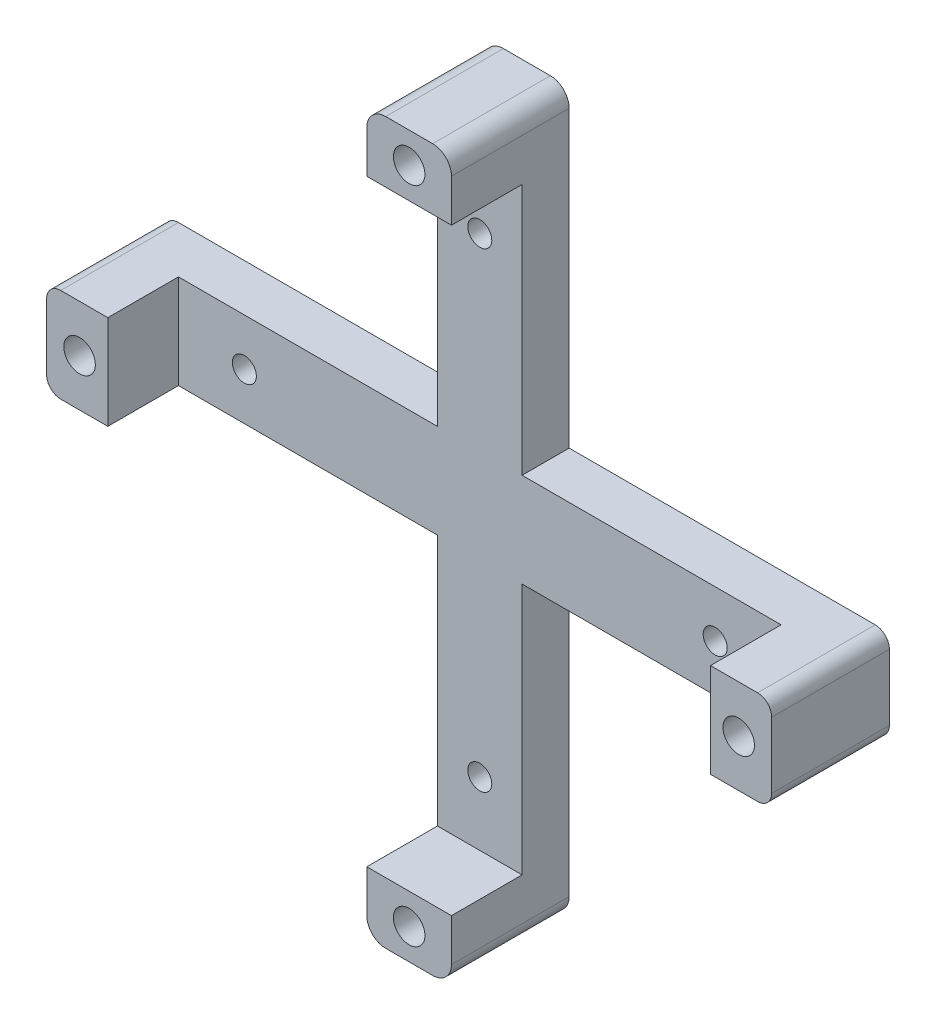
ISO-10303-21;
HEADER;
FILE_DESCRIPTION(('STEP AP214'),'2;1');
FILE_NAME('part.step','',(''),(''),'','','');
FILE_SCHEMA(('AUTOMOTIVE_DESIGN { 1 0 10303 214 1 1 1 1 }'));
ENDSEC;
DATA;
#1=APPLICATION_CONTEXT('core data for automotive mechanical design processes');
#2=APPLICATION_PROTOCOL_DEFINITION('international standard','automotive_design',2000,#1);
#3=PRODUCT_CONTEXT('',#1,'mechanical');
#4=PRODUCT('Part','Part','',(#3));
#5=PRODUCT_RELATED_PRODUCT_CATEGORY('part','',(#4));
#6=PRODUCT_DEFINITION_FORMATION('','',#4);
#7=PRODUCT_DEFINITION_CONTEXT('part definition',#1,'design');
#8=PRODUCT_DEFINITION('design','',#6,#7);
#9=PRODUCT_DEFINITION_SHAPE('','',#8);
#10=(LENGTH_UNIT() NAMED_UNIT(*) SI_UNIT(.MILLI.,.METRE.));
#11=(NAMED_UNIT(*) PLANE_ANGLE_UNIT() SI_UNIT($,.RADIAN.));
#12=(NAMED_UNIT(*) SI_UNIT($,.STERADIAN.) SOLID_ANGLE_UNIT());
#13=UNCERTAINTY_MEASURE_WITH_UNIT(LENGTH_MEASURE(1.E-05),#10,'distance_accuracy_value','');
#14=(GEOMETRIC_REPRESENTATION_CONTEXT(3) GLOBAL_UNCERTAINTY_ASSIGNED_CONTEXT((#13)) GLOBAL_UNIT_ASSIGNED_CONTEXT((#10,
#11,#12)) REPRESENTATION_CONTEXT('',''));
#15=CARTESIAN_POINT('',(0.,0.,0.));
#16=DIRECTION('',(0.,0.,1.));
#17=DIRECTION('',(1.,0.,0.));
#18=AXIS2_PLACEMENT_3D('',#15,#16,#17);
#19=CARTESIAN_POINT('',(93.98,8.89000000000001,12.7));
#20=DIRECTION('',(0.,0.,1.));
#21=DIRECTION('',(1.,0.,0.));
#22=AXIS2_PLACEMENT_3D('',#19,#20,#21);
#23=PLANE('',#22);
#24=CARTESIAN_POINT('',(0.,63.5,12.7));
#25=DIRECTION('',(0.,0.,1.));
#26=DIRECTION('',(1.,0.,0.));
#27=AXIS2_PLACEMENT_3D('',#24,#25,#26);
#28=CIRCLE('',#27,3.2385);
#29=CARTESIAN_POINT('',(3.2385,63.5,12.7));
#30=VERTEX_POINT('',#29);
#31=EDGE_CURVE('E543',#30,#30,#28,.T.);
#32=ORIENTED_EDGE('',*,*,#31,.F.);
#33=EDGE_LOOP('',(#32));
#34=FACE_BOUND('',#33,.T.);
#35=CARTESIAN_POINT('',(63.5,0.,12.7));
#36=DIRECTION('',(0.,0.,1.));
#37=DIRECTION('',(1.,0.,0.));
#38=AXIS2_PLACEMENT_3D('',#35,#36,#37);
#39=CIRCLE('',#38,3.23850000000001);
#40=CARTESIAN_POINT('',(66.7385,0.,12.7));
#41=VERTEX_POINT('',#40);
#42=EDGE_CURVE('E548',#41,#41,#39,.T.);
#43=ORIENTED_EDGE('',*,*,#42,.F.);
#44=EDGE_LOOP('',(#43));
#45=FACE_BOUND('',#44,.T.);
#46=CARTESIAN_POINT('',(0.,-63.5,12.7));
#47=DIRECTION('',(0.,0.,1.));
#48=DIRECTION('',(1.,0.,0.));
#49=AXIS2_PLACEMENT_3D('',#46,#47,#48);
#50=CIRCLE('',#49,3.2385);
#51=CARTESIAN_POINT('',(3.2385,-63.5,12.7));
#52=VERTEX_POINT('',#51);
#53=EDGE_CURVE('E556',#52,#52,#50,.T.);
#54=ORIENTED_EDGE('',*,*,#53,.F.);
#55=EDGE_LOOP('',(#54));
#56=FACE_BOUND('',#55,.T.);
#57=CARTESIAN_POINT('',(-63.5,0.,12.7));
#58=DIRECTION('',(0.,0.,1.));
#59=DIRECTION('',(1.,0.,0.));
#60=AXIS2_PLACEMENT_3D('',#57,#58,#59);
#61=CIRCLE('',#60,3.2385);
#62=CARTESIAN_POINT('',(-60.2615,0.,12.7));
#63=VERTEX_POINT('',#62);
#64=EDGE_CURVE('E562',#63,#63,#61,.T.);
#65=ORIENTED_EDGE('',*,*,#64,.F.);
#66=EDGE_LOOP('',(#65));
#67=FACE_BOUND('',#66,.T.);
#68=DIRECTION('',(0.,-1.,0.));
#69=VECTOR('',#68,1.);
#70=CARTESIAN_POINT('',(-11.4153842055131,-92.075,12.7));
#71=LINE('',#70,#69);
#72=CARTESIAN_POINT('',(-11.4153842055131,-12.7,12.7));
#73=VERTEX_POINT('',#72);
#74=CARTESIAN_POINT('',(-11.4153842055131,-80.645,12.7));
#75=VERTEX_POINT('',#74);
#76=EDGE_CURVE('E61',#73,#75,#71,.T.);
#77=ORIENTED_EDGE('',*,*,#76,.T.);
#78=DIRECTION('',(-1.,0.,0.));
#79=VECTOR('',#78,1.);
#80=CARTESIAN_POINT('',(0.,-80.645,12.7));
#81=LINE('',#80,#79);
#82=CARTESIAN_POINT('',(11.4153842055131,-80.645,12.7));
#83=VERTEX_POINT('',#82);
#84=EDGE_CURVE('E56',#83,#75,#81,.T.);
#85=ORIENTED_EDGE('',*,*,#84,.F.);
#86=DIRECTION('',(0.,1.,0.));
#87=VECTOR('',#86,1.);
#88=CARTESIAN_POINT('',(11.4153842055131,-92.075,12.7));
#89=LINE('',#88,#87);
#90=CARTESIAN_POINT('',(11.4153842055131,-12.7,12.7));
#91=VERTEX_POINT('',#90);
#92=EDGE_CURVE('E248',#83,#91,#89,.T.);
#93=ORIENTED_EDGE('',*,*,#92,.T.);
#94=DIRECTION('',(1.,0.,0.));
#95=VECTOR('',#94,1.);
#96=CARTESIAN_POINT('',(93.98,-12.7,12.7));
#97=LINE('',#96,#95);
#98=CARTESIAN_POINT('',(81.28,-12.7,12.7));
#99=VERTEX_POINT('',#98);
#100=EDGE_CURVE('E403',#91,#99,#97,.T.);
#101=ORIENTED_EDGE('',*,*,#100,.T.);
#102=DIRECTION('',(0.,-1.,0.));
#103=VECTOR('',#102,1.);
#104=CARTESIAN_POINT('',(81.28,0.,12.7));
#105=LINE('',#104,#103);
#106=CARTESIAN_POINT('',(81.28,12.7,12.7));
#107=VERTEX_POINT('',#106);
#108=EDGE_CURVE('E249',#107,#99,#105,.T.);
#109=ORIENTED_EDGE('',*,*,#108,.F.);
#110=DIRECTION('',(-1.,0.,0.));
#111=VECTOR('',#110,1.);
#112=CARTESIAN_POINT('',(93.98,12.7,12.7));
#113=LINE('',#112,#111);
#114=CARTESIAN_POINT('',(11.4153842055131,12.7,12.7));
#115=VERTEX_POINT('',#114);
#116=EDGE_CURVE('E401',#107,#115,#113,.T.);
#117=ORIENTED_EDGE('',*,*,#116,.T.);
#118=CARTESIAN_POINT('',(11.4153842055131,80.645,12.7));
#119=VERTEX_POINT('',#118);
#120=EDGE_CURVE('E344',#115,#119,#89,.T.);
#121=ORIENTED_EDGE('',*,*,#120,.T.);
#122=DIRECTION('',(1.,0.,0.));
#123=VECTOR('',#122,1.);
#124=CARTESIAN_POINT('',(0.,80.645,12.7));
#125=LINE('',#124,#123);
#126=CARTESIAN_POINT('',(-11.4153842055131,80.645,12.7));
#127=VERTEX_POINT('',#126);
#128=EDGE_CURVE('E282',#127,#119,#125,.T.);
#129=ORIENTED_EDGE('',*,*,#128,.F.);
#130=CARTESIAN_POINT('',(-11.4153842055131,12.7,12.7));
#131=VERTEX_POINT('',#130);
#132=EDGE_CURVE('E349',#127,#131,#71,.T.);
#133=ORIENTED_EDGE('',*,*,#132,.T.);
#134=CARTESIAN_POINT('',(-81.28,12.7,12.7));
#135=VERTEX_POINT('',#134);
#136=EDGE_CURVE('E404',#131,#135,#113,.T.);
#137=ORIENTED_EDGE('',*,*,#136,.T.);
#138=DIRECTION('',(0.,-1.,0.));
#139=VECTOR('',#138,1.);
#140=CARTESIAN_POINT('',(-81.28,0.,12.7));
#141=LINE('',#140,#139);
#142=CARTESIAN_POINT('',(-81.28,-12.7,12.7));
#143=VERTEX_POINT('',#142);
#144=EDGE_CURVE('E311',#135,#143,#141,.T.);
#145=ORIENTED_EDGE('',*,*,#144,.T.);
#146=EDGE_CURVE('E405',#143,#73,#97,.T.);
#147=ORIENTED_EDGE('',*,*,#146,.T.);
#148=EDGE_LOOP('',(#77,#85,#93,#101,#109,#117,#121,#129,#133,#137,#145,#147));
#149=FACE_BOUND('',#148,.T.);
#150=ADVANCED_FACE('F41',(#34,#45,#56,#67,#149),#23,.T.);
#151=CARTESIAN_POINT('',(93.98,12.7,12.7));
#152=DIRECTION('',(0.,-1.,0.));
#153=DIRECTION('',(1.,0.,0.));
#154=AXIS2_PLACEMENT_3D('',#151,#152,#153);
#155=PLANE('',#154);
#156=ORIENTED_EDGE('',*,*,#136,.F.);
#157=DIRECTION('',(0.,0.,-1.));
#158=VECTOR('',#157,1.);
#159=CARTESIAN_POINT('',(-11.4153842055131,12.7,12.7));
#160=LINE('',#159,#158);
#161=CARTESIAN_POINT('',(-11.4153842055131,12.7,0.));
#162=VERTEX_POINT('',#161);
#163=EDGE_CURVE('E391',#131,#162,#160,.T.);
#164=ORIENTED_EDGE('',*,*,#163,.T.);
#165=DIRECTION('',(-1.,0.,0.));
#166=VECTOR('',#165,1.);
#167=CARTESIAN_POINT('',(93.98,12.7,0.));
#168=LINE('',#167,#166);
#169=CARTESIAN_POINT('',(-93.98,12.7,0.));
#170=VERTEX_POINT('',#169);
#171=EDGE_CURVE('E410',#162,#170,#168,.T.);
#172=ORIENTED_EDGE('',*,*,#171,.T.);
#173=DIRECTION('',(0.,0.,-1.));
#174=VECTOR('',#173,1.);
#175=CARTESIAN_POINT('',(-93.98,12.7,12.7));
#176=LINE('',#175,#174);
#177=CARTESIAN_POINT('',(-93.98,12.7,31.75));
#178=VERTEX_POINT('',#177);
#179=EDGE_CURVE('E445',#178,#170,#176,.T.);
#180=ORIENTED_EDGE('',*,*,#179,.F.);
#181=DIRECTION('',(-1.,0.,0.));
#182=VECTOR('',#181,1.);
#183=CARTESIAN_POINT('',(0.,12.7,31.75));
#184=LINE('',#183,#182);
#185=CARTESIAN_POINT('',(-81.28,12.7,31.75));
#186=VERTEX_POINT('',#185);
#187=EDGE_CURVE('E315',#186,#178,#184,.T.);
#188=ORIENTED_EDGE('',*,*,#187,.F.);
#189=DIRECTION('',(0.,0.,-1.));
#190=VECTOR('',#189,1.);
#191=CARTESIAN_POINT('',(-81.28,12.7,31.75));
#192=LINE('',#191,#190);
#193=EDGE_CURVE('E336',#186,#135,#192,.T.);
#194=ORIENTED_EDGE('',*,*,#193,.T.);
#195=EDGE_LOOP('',(#156,#164,#172,#180,#188,#194));
#196=FACE_BOUND('',#195,.T.);
#197=ADVANCED_FACE('F511',(#196),#155,.F.);
#198=CARTESIAN_POINT('',(93.98,-12.7,12.7));
#199=DIRECTION('',(0.,1.,0.));
#200=DIRECTION('',(-1.,0.,0.));
#201=AXIS2_PLACEMENT_3D('',#198,#199,#200);
#202=PLANE('',#201);
#203=DIRECTION('',(1.,0.,0.));
#204=VECTOR('',#203,1.);
#205=CARTESIAN_POINT('',(93.98,-12.7,0.));
#206=LINE('',#205,#204);
#207=CARTESIAN_POINT('',(-93.98,-12.7,0.));
#208=VERTEX_POINT('',#207);
#209=CARTESIAN_POINT('',(-11.4153842055131,-12.7,0.));
#210=VERTEX_POINT('',#209);
#211=EDGE_CURVE('E421',#208,#210,#206,.T.);
#212=ORIENTED_EDGE('',*,*,#211,.T.);
#213=DIRECTION('',(0.,0.,1.));
#214=VECTOR('',#213,1.);
#215=CARTESIAN_POINT('',(-11.4153842055131,-12.7,12.7));
#216=LINE('',#215,#214);
#217=EDGE_CURVE('E11',#210,#73,#216,.T.);
#218=ORIENTED_EDGE('',*,*,#217,.T.);
#219=ORIENTED_EDGE('',*,*,#146,.F.);
#220=DIRECTION('',(0.,0.,-1.));
#221=VECTOR('',#220,1.);
#222=CARTESIAN_POINT('',(-81.28,-12.7,31.75));
#223=LINE('',#222,#221);
#224=CARTESIAN_POINT('',(-81.28,-12.7,31.75));
#225=VERTEX_POINT('',#224);
#226=EDGE_CURVE('E332',#225,#143,#223,.T.);
#227=ORIENTED_EDGE('',*,*,#226,.F.);
#228=DIRECTION('',(1.,0.,0.));
#229=VECTOR('',#228,1.);
#230=CARTESIAN_POINT('',(0.,-12.7,31.75));
#231=LINE('',#230,#229);
#232=CARTESIAN_POINT('',(-93.98,-12.7,31.75));
#233=VERTEX_POINT('',#232);
#234=EDGE_CURVE('E327',#233,#225,#231,.T.);
#235=ORIENTED_EDGE('',*,*,#234,.F.);
#236=DIRECTION('',(0.,0.,-1.));
#237=VECTOR('',#236,1.);
#238=CARTESIAN_POINT('',(-93.98,-12.7,12.7));
#239=LINE('',#238,#237);
#240=EDGE_CURVE('E436',#233,#208,#239,.T.);
#241=ORIENTED_EDGE('',*,*,#240,.T.);
#242=EDGE_LOOP('',(#212,#218,#219,#227,#235,#241));
#243=FACE_BOUND('',#242,.T.);
#244=ADVANCED_FACE('F518',(#243),#202,.F.);
#245=CARTESIAN_POINT('',(93.98,8.89000000000001,0.));
#246=DIRECTION('',(0.,0.,1.));
#247=DIRECTION('',(1.,0.,0.));
#248=AXIS2_PLACEMENT_3D('',#245,#246,#247);
#249=PLANE('',#248);
#250=CARTESIAN_POINT('',(0.,63.5,0.));
#251=DIRECTION('',(0.,0.,1.));
#252=DIRECTION('',(1.,0.,0.));
#253=AXIS2_PLACEMENT_3D('',#250,#251,#252);
#254=CIRCLE('',#253,3.2385);
#255=CARTESIAN_POINT('',(3.2385,63.5,0.));
#256=VERTEX_POINT('',#255);
#257=EDGE_CURVE('E539',#256,#256,#254,.T.);
#258=ORIENTED_EDGE('',*,*,#257,.T.);
#259=EDGE_LOOP('',(#258));
#260=FACE_BOUND('',#259,.T.);
#261=CARTESIAN_POINT('',(63.5,0.,0.));
#262=DIRECTION('',(0.,0.,1.));
#263=DIRECTION('',(1.,0.,0.));
#264=AXIS2_PLACEMENT_3D('',#261,#262,#263);
#265=CIRCLE('',#264,3.23850000000001);
#266=CARTESIAN_POINT('',(66.7385,0.,0.));
#267=VERTEX_POINT('',#266);
#268=EDGE_CURVE('E553',#267,#267,#265,.T.);
#269=ORIENTED_EDGE('',*,*,#268,.T.);
#270=EDGE_LOOP('',(#269));
#271=FACE_BOUND('',#270,.T.);
#272=CARTESIAN_POINT('',(0.,-63.5,0.));
#273=DIRECTION('',(0.,0.,1.));
#274=DIRECTION('',(1.,0.,0.));
#275=AXIS2_PLACEMENT_3D('',#272,#273,#274);
#276=CIRCLE('',#275,3.2385);
#277=CARTESIAN_POINT('',(3.2385,-63.5,0.));
#278=VERTEX_POINT('',#277);
#279=EDGE_CURVE('E559',#278,#278,#276,.T.);
#280=ORIENTED_EDGE('',*,*,#279,.T.);
#281=EDGE_LOOP('',(#280));
#282=FACE_BOUND('',#281,.T.);
#283=CARTESIAN_POINT('',(-63.5,0.,0.));
#284=DIRECTION('',(0.,0.,1.));
#285=DIRECTION('',(1.,0.,0.));
#286=AXIS2_PLACEMENT_3D('',#283,#284,#285);
#287=CIRCLE('',#286,3.2385);
#288=CARTESIAN_POINT('',(-60.2615,0.,0.));
#289=VERTEX_POINT('',#288);
#290=EDGE_CURVE('E565',#289,#289,#287,.T.);
#291=ORIENTED_EDGE('',*,*,#290,.T.);
#292=EDGE_LOOP('',(#291));
#293=FACE_BOUND('',#292,.T.);
#294=CARTESIAN_POINT('',(11.4153842055131,-12.7,0.));
#295=VERTEX_POINT('',#294);
#296=CARTESIAN_POINT('',(93.98,-12.7,0.));
#297=VERTEX_POINT('',#296);
#298=EDGE_CURVE('E420',#295,#297,#206,.T.);
#299=ORIENTED_EDGE('',*,*,#298,.F.);
#300=DIRECTION('',(0.,1.,0.));
#301=VECTOR('',#300,1.);
#302=CARTESIAN_POINT('',(11.4153842055131,-92.075,0.));
#303=LINE('',#302,#301);
#304=CARTESIAN_POINT('',(11.4153842055131,-92.075,0.));
#305=VERTEX_POINT('',#304);
#306=EDGE_CURVE('E356',#305,#295,#303,.T.);
#307=ORIENTED_EDGE('',*,*,#306,.F.);
#308=CARTESIAN_POINT('',(6.33538420551314,-92.075,0.));
#309=DIRECTION('',(0.,0.,1.));
#310=DIRECTION('',(1.,0.,0.));
#311=AXIS2_PLACEMENT_3D('',#308,#309,#310);
#312=CIRCLE('',#311,5.07999999999999);
#313=CARTESIAN_POINT('',(6.33538420551314,-97.155,0.));
#314=VERTEX_POINT('',#313);
#315=EDGE_CURVE('E352',#314,#305,#312,.T.);
#316=ORIENTED_EDGE('',*,*,#315,.F.);
#317=DIRECTION('',(1.,0.,0.));
#318=VECTOR('',#317,1.);
#319=CARTESIAN_POINT('',(-6.33538420551314,-97.155,0.));
#320=LINE('',#319,#318);
#321=CARTESIAN_POINT('',(-6.33538420551314,-97.155,0.));
#322=VERTEX_POINT('',#321);
#323=EDGE_CURVE('E348',#322,#314,#320,.T.);
#324=ORIENTED_EDGE('',*,*,#323,.F.);
#325=CARTESIAN_POINT('',(-6.33538420551314,-92.075,0.));
#326=DIRECTION('',(0.,0.,1.));
#327=DIRECTION('',(-1.,0.,0.));
#328=AXIS2_PLACEMENT_3D('',#325,#326,#327);
#329=CIRCLE('',#328,5.07999999999999);
#330=CARTESIAN_POINT('',(-11.4153842055131,-92.075,0.));
#331=VERTEX_POINT('',#330);
#332=EDGE_CURVE('E345',#331,#322,#329,.T.);
#333=ORIENTED_EDGE('',*,*,#332,.F.);
#334=DIRECTION('',(0.,-1.,0.));
#335=VECTOR('',#334,1.);
#336=CARTESIAN_POINT('',(-11.4153842055131,-92.075,0.));
#337=LINE('',#336,#335);
#338=EDGE_CURVE('E367',#210,#331,#337,.T.);
#339=ORIENTED_EDGE('',*,*,#338,.F.);
#340=ORIENTED_EDGE('',*,*,#211,.F.);
#341=CARTESIAN_POINT('',(-93.98,-8.89000000000001,0.));
#342=DIRECTION('',(0.,0.,1.));
#343=DIRECTION('',(-1.,0.,0.));
#344=AXIS2_PLACEMENT_3D('',#341,#342,#343);
#345=CIRCLE('',#344,3.81);
#346=CARTESIAN_POINT('',(-97.79,-8.89000000000001,0.));
#347=VERTEX_POINT('',#346);
#348=EDGE_CURVE('E418',#347,#208,#345,.T.);
#349=ORIENTED_EDGE('',*,*,#348,.F.);
#350=DIRECTION('',(0.,-1.,0.));
#351=VECTOR('',#350,1.);
#352=CARTESIAN_POINT('',(-97.79,-8.89000000000001,0.));
#353=LINE('',#352,#351);
#354=CARTESIAN_POINT('',(-97.79,8.88999999999999,0.));
#355=VERTEX_POINT('',#354);
#356=EDGE_CURVE('E416',#355,#347,#353,.T.);
#357=ORIENTED_EDGE('',*,*,#356,.F.);
#358=CARTESIAN_POINT('',(-93.98,8.88999999999999,0.));
#359=DIRECTION('',(0.,0.,1.));
#360=DIRECTION('',(1.,0.,0.));
#361=AXIS2_PLACEMENT_3D('',#358,#359,#360);
#362=CIRCLE('',#361,3.81);
#363=EDGE_CURVE('E414',#170,#355,#362,.T.);
#364=ORIENTED_EDGE('',*,*,#363,.F.);
#365=ORIENTED_EDGE('',*,*,#171,.F.);
#366=CARTESIAN_POINT('',(-11.4153842055131,92.075,0.));
#367=VERTEX_POINT('',#366);
#368=EDGE_CURVE('E368',#367,#162,#337,.T.);
#369=ORIENTED_EDGE('',*,*,#368,.F.);
#370=CARTESIAN_POINT('',(-6.33538420551314,92.075,0.));
#371=DIRECTION('',(0.,0.,1.));
#372=DIRECTION('',(-1.,0.,0.));
#373=AXIS2_PLACEMENT_3D('',#370,#371,#372);
#374=CIRCLE('',#373,5.08000000000001);
#375=CARTESIAN_POINT('',(-6.33538420551314,97.155,0.));
#376=VERTEX_POINT('',#375);
#377=EDGE_CURVE('E364',#376,#367,#374,.T.);
#378=ORIENTED_EDGE('',*,*,#377,.F.);
#379=DIRECTION('',(-1.,0.,0.));
#380=VECTOR('',#379,1.);
#381=CARTESIAN_POINT('',(-6.33538420551314,97.155,0.));
#382=LINE('',#381,#380);
#383=CARTESIAN_POINT('',(6.33538420551314,97.155,0.));
#384=VERTEX_POINT('',#383);
#385=EDGE_CURVE('E361',#384,#376,#382,.T.);
#386=ORIENTED_EDGE('',*,*,#385,.F.);
#387=CARTESIAN_POINT('',(6.33538420551314,92.075,0.));
#388=DIRECTION('',(0.,0.,1.));
#389=DIRECTION('',(-1.,0.,0.));
#390=AXIS2_PLACEMENT_3D('',#387,#388,#389);
#391=CIRCLE('',#390,5.08000000000001);
#392=CARTESIAN_POINT('',(11.4153842055131,92.075,0.));
#393=VERTEX_POINT('',#392);
#394=EDGE_CURVE('E358',#393,#384,#391,.T.);
#395=ORIENTED_EDGE('',*,*,#394,.F.);
#396=CARTESIAN_POINT('',(11.4153842055131,12.7,0.));
#397=VERTEX_POINT('',#396);
#398=EDGE_CURVE('E355',#397,#393,#303,.T.);
#399=ORIENTED_EDGE('',*,*,#398,.F.);
#400=CARTESIAN_POINT('',(93.98,12.7,0.));
#401=VERTEX_POINT('',#400);
#402=EDGE_CURVE('E411',#401,#397,#168,.T.);
#403=ORIENTED_EDGE('',*,*,#402,.F.);
#404=CARTESIAN_POINT('',(93.98,8.89000000000001,0.));
#405=DIRECTION('',(0.,0.,1.));
#406=DIRECTION('',(1.,0.,0.));
#407=AXIS2_PLACEMENT_3D('',#404,#405,#406);
#408=CIRCLE('',#407,3.81);
#409=CARTESIAN_POINT('',(97.79,8.89000000000001,0.));
#410=VERTEX_POINT('',#409);
#411=EDGE_CURVE('E400',#410,#401,#408,.T.);
#412=ORIENTED_EDGE('',*,*,#411,.F.);
#413=DIRECTION('',(0.,1.,0.));
#414=VECTOR('',#413,1.);
#415=CARTESIAN_POINT('',(97.79,-8.88999999999999,0.));
#416=LINE('',#415,#414);
#417=CARTESIAN_POINT('',(97.79,-8.88999999999999,0.));
#418=VERTEX_POINT('',#417);
#419=EDGE_CURVE('E426',#418,#410,#416,.T.);
#420=ORIENTED_EDGE('',*,*,#419,.F.);
#421=CARTESIAN_POINT('',(93.98,-8.88999999999999,0.));
#422=DIRECTION('',(0.,0.,1.));
#423=DIRECTION('',(1.,0.,0.));
#424=AXIS2_PLACEMENT_3D('',#421,#422,#423);
#425=CIRCLE('',#424,3.81);
#426=EDGE_CURVE('E424',#297,#418,#425,.T.);
#427=ORIENTED_EDGE('',*,*,#426,.F.);
#428=EDGE_LOOP('',(#299,#307,#316,#324,#333,#339,#340,#349,#357,#364,#365,#369,#378,#386,#395,
#399,#403,#412,#420,#427));
#429=FACE_BOUND('',#428,.T.);
#430=CARTESIAN_POINT('',(88.9,0.,0.));
#431=DIRECTION('',(0.,0.,1.));
#432=DIRECTION('',(1.,0.,0.));
#433=AXIS2_PLACEMENT_3D('',#430,#431,#432);
#434=CIRCLE('',#433,4.25000000000001);
#435=CARTESIAN_POINT('',(93.15,0.,0.));
#436=VERTEX_POINT('',#435);
#437=EDGE_CURVE('E394',#436,#436,#434,.T.);
#438=ORIENTED_EDGE('',*,*,#437,.T.);
#439=EDGE_LOOP('',(#438));
#440=FACE_BOUND('',#439,.T.);
#441=CARTESIAN_POINT('',(0.,-88.9,0.));
#442=DIRECTION('',(0.,0.,1.));
#443=DIRECTION('',(1.,0.,0.));
#444=AXIS2_PLACEMENT_3D('',#441,#442,#443);
#445=CIRCLE('',#444,4.25);
#446=CARTESIAN_POINT('',(4.25,-88.9,0.));
#447=VERTEX_POINT('',#446);
#448=EDGE_CURVE('E338',#447,#447,#445,.T.);
#449=ORIENTED_EDGE('',*,*,#448,.T.);
#450=EDGE_LOOP('',(#449));
#451=FACE_BOUND('',#450,.T.);
#452=CARTESIAN_POINT('',(0.,88.9,0.));
#453=DIRECTION('',(0.,0.,1.));
#454=DIRECTION('',(1.,0.,0.));
#455=AXIS2_PLACEMENT_3D('',#452,#453,#454);
#456=CIRCLE('',#455,4.25);
#457=CARTESIAN_POINT('',(4.25,88.9,0.));
#458=VERTEX_POINT('',#457);
#459=EDGE_CURVE('E341',#458,#458,#456,.T.);
#460=ORIENTED_EDGE('',*,*,#459,.T.);
#461=EDGE_LOOP('',(#460));
#462=FACE_BOUND('',#461,.T.);
#463=CARTESIAN_POINT('',(-88.9,0.,0.));
#464=DIRECTION('',(0.,0.,1.));
#465=DIRECTION('',(1.,0.,0.));
#466=AXIS2_PLACEMENT_3D('',#463,#464,#465);
#467=CIRCLE('',#466,4.25000000000001);
#468=CARTESIAN_POINT('',(-84.65,0.,0.));
#469=VERTEX_POINT('',#468);
#470=EDGE_CURVE('E397',#469,#469,#467,.T.);
#471=ORIENTED_EDGE('',*,*,#470,.T.);
#472=EDGE_LOOP('',(#471));
#473=FACE_BOUND('',#472,.T.);
#474=ADVANCED_FACE('F458',(#260,#271,#282,#293,#429,#440,#451,#462,#473),#249,.F.);
#475=CARTESIAN_POINT('',(93.98,8.89000000000001,12.7));
#476=DIRECTION('',(0.,0.,-1.));
#477=DIRECTION('',(-1.,0.,0.));
#478=AXIS2_PLACEMENT_3D('',#475,#476,#477);
#479=CYLINDRICAL_SURFACE('',#478,3.81);
#480=ORIENTED_EDGE('',*,*,#411,.T.);
#481=DIRECTION('',(0.,0.,-1.));
#482=VECTOR('',#481,1.);
#483=CARTESIAN_POINT('',(93.98,12.7,12.7));
#484=LINE('',#483,#482);
#485=CARTESIAN_POINT('',(93.98,12.7,31.75));
#486=VERTEX_POINT('',#485);
#487=EDGE_CURVE('E448',#486,#401,#484,.T.);
#488=ORIENTED_EDGE('',*,*,#487,.F.);
#489=CARTESIAN_POINT('',(93.98,8.89000000000001,31.75));
#490=DIRECTION('',(0.,0.,1.));
#491=DIRECTION('',(1.,0.,0.));
#492=AXIS2_PLACEMENT_3D('',#489,#490,#491);
#493=CIRCLE('',#492,3.81);
#494=CARTESIAN_POINT('',(97.79,8.89000000000001,31.75));
#495=VERTEX_POINT('',#494);
#496=EDGE_CURVE('E273',#495,#486,#493,.T.);
#497=ORIENTED_EDGE('',*,*,#496,.F.);
#498=DIRECTION('',(0.,0.,-1.));
#499=VECTOR('',#498,1.);
#500=CARTESIAN_POINT('',(97.79,8.89000000000001,12.7));
#501=LINE('',#500,#499);
#502=EDGE_CURVE('E407',#495,#410,#501,.T.);
#503=ORIENTED_EDGE('',*,*,#502,.T.);
#504=EDGE_LOOP('',(#480,#488,#497,#503));
#505=FACE_BOUND('',#504,.T.);
#506=ADVANCED_FACE('F43',(#505),#479,.T.);
#507=ORIENTED_EDGE('',*,*,#402,.T.);
#508=DIRECTION('',(0.,0.,1.));
#509=VECTOR('',#508,1.);
#510=CARTESIAN_POINT('',(11.4153842055131,12.7,12.7));
#511=LINE('',#510,#509);
#512=EDGE_CURVE('E375',#397,#115,#511,.T.);
#513=ORIENTED_EDGE('',*,*,#512,.T.);
#514=ORIENTED_EDGE('',*,*,#116,.F.);
#515=DIRECTION('',(0.,0.,-1.));
#516=VECTOR('',#515,1.);
#517=CARTESIAN_POINT('',(81.28,12.7,31.75));
#518=LINE('',#517,#516);
#519=CARTESIAN_POINT('',(81.28,12.7,31.75));
#520=VERTEX_POINT('',#519);
#521=EDGE_CURVE('E279',#520,#107,#518,.T.);
#522=ORIENTED_EDGE('',*,*,#521,.F.);
#523=DIRECTION('',(-1.,0.,0.));
#524=VECTOR('',#523,1.);
#525=CARTESIAN_POINT('',(0.,12.7,31.75));
#526=LINE('',#525,#524);
#527=EDGE_CURVE('E259',#486,#520,#526,.T.);
#528=ORIENTED_EDGE('',*,*,#527,.F.);
#529=ORIENTED_EDGE('',*,*,#487,.T.);
#530=EDGE_LOOP('',(#507,#513,#514,#522,#528,#529));
#531=FACE_BOUND('',#530,.T.);
#532=ADVANCED_FACE('F475',(#531),#155,.F.);
#533=CARTESIAN_POINT('',(-93.98,8.88999999999999,12.7));
#534=DIRECTION('',(0.,0.,-1.));
#535=DIRECTION('',(-1.,0.,0.));
#536=AXIS2_PLACEMENT_3D('',#533,#534,#535);
#537=CYLINDRICAL_SURFACE('',#536,3.81);
#538=ORIENTED_EDGE('',*,*,#363,.T.);
#539=DIRECTION('',(0.,0.,-1.));
#540=VECTOR('',#539,1.);
#541=CARTESIAN_POINT('',(-97.79,8.88999999999999,12.7));
#542=LINE('',#541,#540);
#543=CARTESIAN_POINT('',(-97.79,8.88999999999998,31.75));
#544=VERTEX_POINT('',#543);
#545=EDGE_CURVE('E442',#544,#355,#542,.T.);
#546=ORIENTED_EDGE('',*,*,#545,.F.);
#547=CARTESIAN_POINT('',(-93.98,8.88999999999999,31.75));
#548=DIRECTION('',(0.,0.,1.));
#549=DIRECTION('',(1.,0.,0.));
#550=AXIS2_PLACEMENT_3D('',#547,#548,#549);
#551=CIRCLE('',#550,3.81);
#552=EDGE_CURVE('E318',#178,#544,#551,.T.);
#553=ORIENTED_EDGE('',*,*,#552,.F.);
#554=ORIENTED_EDGE('',*,*,#179,.T.);
#555=EDGE_LOOP('',(#538,#546,#553,#554));
#556=FACE_BOUND('',#555,.T.);
#557=ADVANCED_FACE('F604',(#556),#537,.T.);
#558=CARTESIAN_POINT('',(-97.79,-8.89000000000001,12.7));
#559=DIRECTION('',(1.,0.,0.));
#560=DIRECTION('',(0.,0.,-1.));
#561=AXIS2_PLACEMENT_3D('',#558,#559,#560);
#562=PLANE('',#561);
#563=ORIENTED_EDGE('',*,*,#356,.T.);
#564=DIRECTION('',(0.,0.,-1.));
#565=VECTOR('',#564,1.);
#566=CARTESIAN_POINT('',(-97.79,-8.89000000000001,12.7));
#567=LINE('',#566,#565);
#568=CARTESIAN_POINT('',(-97.79,-8.89000000000001,31.75));
#569=VERTEX_POINT('',#568);
#570=EDGE_CURVE('E439',#569,#347,#567,.T.);
#571=ORIENTED_EDGE('',*,*,#570,.F.);
#572=DIRECTION('',(0.,-1.,0.));
#573=VECTOR('',#572,1.);
#574=CARTESIAN_POINT('',(-97.79,0.,31.75));
#575=LINE('',#574,#573);
#576=EDGE_CURVE('E321',#544,#569,#575,.T.);
#577=ORIENTED_EDGE('',*,*,#576,.F.);
#578=ORIENTED_EDGE('',*,*,#545,.T.);
#579=EDGE_LOOP('',(#563,#571,#577,#578));
#580=FACE_BOUND('',#579,.T.);
#581=ADVANCED_FACE('F600',(#580),#562,.F.);
#582=CARTESIAN_POINT('',(-93.98,-8.89000000000001,12.7));
#583=DIRECTION('',(0.,0.,-1.));
#584=DIRECTION('',(-1.,0.,0.));
#585=AXIS2_PLACEMENT_3D('',#582,#583,#584);
#586=CYLINDRICAL_SURFACE('',#585,3.81);
#587=ORIENTED_EDGE('',*,*,#348,.T.);
#588=ORIENTED_EDGE('',*,*,#240,.F.);
#589=CARTESIAN_POINT('',(-93.98,-8.89000000000001,31.75));
#590=DIRECTION('',(0.,0.,1.));
#591=DIRECTION('',(1.,0.,0.));
#592=AXIS2_PLACEMENT_3D('',#589,#590,#591);
#593=CIRCLE('',#592,3.81);
#594=EDGE_CURVE('E324',#569,#233,#593,.T.);
#595=ORIENTED_EDGE('',*,*,#594,.F.);
#596=ORIENTED_EDGE('',*,*,#570,.T.);
#597=EDGE_LOOP('',(#587,#588,#595,#596));
#598=FACE_BOUND('',#597,.T.);
#599=ADVANCED_FACE('F597',(#598),#586,.T.);
#600=ORIENTED_EDGE('',*,*,#100,.F.);
#601=DIRECTION('',(0.,0.,-1.));
#602=VECTOR('',#601,1.);
#603=CARTESIAN_POINT('',(11.4153842055131,-12.7,12.7));
#604=LINE('',#603,#602);
#605=EDGE_CURVE('E49',#91,#295,#604,.T.);
#606=ORIENTED_EDGE('',*,*,#605,.T.);
#607=ORIENTED_EDGE('',*,*,#298,.T.);
#608=DIRECTION('',(0.,0.,-1.));
#609=VECTOR('',#608,1.);
#610=CARTESIAN_POINT('',(93.98,-12.7,12.7));
#611=LINE('',#610,#609);
#612=CARTESIAN_POINT('',(93.98,-12.7,31.75));
#613=VERTEX_POINT('',#612);
#614=EDGE_CURVE('E433',#613,#297,#611,.T.);
#615=ORIENTED_EDGE('',*,*,#614,.F.);
#616=DIRECTION('',(1.,0.,0.));
#617=VECTOR('',#616,1.);
#618=CARTESIAN_POINT('',(0.,-12.7,31.75));
#619=LINE('',#618,#617);
#620=CARTESIAN_POINT('',(81.28,-12.7,31.75));
#621=VERTEX_POINT('',#620);
#622=EDGE_CURVE('E264',#621,#613,#619,.T.);
#623=ORIENTED_EDGE('',*,*,#622,.F.);
#624=DIRECTION('',(0.,0.,-1.));
#625=VECTOR('',#624,1.);
#626=CARTESIAN_POINT('',(81.28,-12.7,31.75));
#627=LINE('',#626,#625);
#628=EDGE_CURVE('E275',#621,#99,#627,.T.);
#629=ORIENTED_EDGE('',*,*,#628,.T.);
#630=EDGE_LOOP('',(#600,#606,#607,#615,#623,#629));
#631=FACE_BOUND('',#630,.T.);
#632=ADVANCED_FACE('F454',(#631),#202,.F.);
#633=CARTESIAN_POINT('',(93.98,-8.88999999999999,12.7));
#634=DIRECTION('',(0.,0.,-1.));
#635=DIRECTION('',(-1.,0.,0.));
#636=AXIS2_PLACEMENT_3D('',#633,#634,#635);
#637=CYLINDRICAL_SURFACE('',#636,3.81);
#638=ORIENTED_EDGE('',*,*,#426,.T.);
#639=DIRECTION('',(0.,0.,-1.));
#640=VECTOR('',#639,1.);
#641=CARTESIAN_POINT('',(97.79,-8.88999999999999,12.7));
#642=LINE('',#641,#640);
#643=CARTESIAN_POINT('',(97.79,-8.88999999999999,31.75));
#644=VERTEX_POINT('',#643);
#645=EDGE_CURVE('E430',#644,#418,#642,.T.);
#646=ORIENTED_EDGE('',*,*,#645,.F.);
#647=CARTESIAN_POINT('',(93.98,-8.88999999999999,31.75));
#648=DIRECTION('',(0.,0.,1.));
#649=DIRECTION('',(1.,0.,0.));
#650=AXIS2_PLACEMENT_3D('',#647,#648,#649);
#651=CIRCLE('',#650,3.81);
#652=EDGE_CURVE('E267',#613,#644,#651,.T.);
#653=ORIENTED_EDGE('',*,*,#652,.F.);
#654=ORIENTED_EDGE('',*,*,#614,.T.);
#655=EDGE_LOOP('',(#638,#646,#653,#654));
#656=FACE_BOUND('',#655,.T.);
#657=ADVANCED_FACE('F464',(#656),#637,.T.);
#658=CARTESIAN_POINT('',(97.79,-8.88999999999999,12.7));
#659=DIRECTION('',(-1.,0.,0.));
#660=DIRECTION('',(0.,0.,1.));
#661=AXIS2_PLACEMENT_3D('',#658,#659,#660);
#662=PLANE('',#661);
#663=ORIENTED_EDGE('',*,*,#419,.T.);
#664=ORIENTED_EDGE('',*,*,#502,.F.);
#665=DIRECTION('',(0.,1.,0.));
#666=VECTOR('',#665,1.);
#667=CARTESIAN_POINT('',(97.79,0.,31.75));
#668=LINE('',#667,#666);
#669=EDGE_CURVE('E270',#644,#495,#668,.T.);
#670=ORIENTED_EDGE('',*,*,#669,.F.);
#671=ORIENTED_EDGE('',*,*,#645,.T.);
#672=EDGE_LOOP('',(#663,#664,#670,#671));
#673=FACE_BOUND('',#672,.T.);
#674=ADVANCED_FACE('F468',(#673),#662,.F.);
#675=CARTESIAN_POINT('',(-88.9,0.,12.7));
#676=DIRECTION('',(0.,0.,-1.));
#677=DIRECTION('',(-1.,0.,0.));
#678=AXIS2_PLACEMENT_3D('',#675,#676,#677);
#679=CYLINDRICAL_SURFACE('',#678,4.25000000000001);
#680=ORIENTED_EDGE('',*,*,#470,.F.);
#681=EDGE_LOOP('',(#680));
#682=FACE_BOUND('',#681,.T.);
#683=CARTESIAN_POINT('',(-88.9,0.,31.75));
#684=DIRECTION('',(0.,0.,1.));
#685=DIRECTION('',(1.,0.,0.));
#686=AXIS2_PLACEMENT_3D('',#683,#684,#685);
#687=CIRCLE('',#686,4.25000000000001);
#688=CARTESIAN_POINT('',(-84.65,0.,31.75));
#689=VERTEX_POINT('',#688);
#690=EDGE_CURVE('E329',#689,#689,#687,.F.);
#691=ORIENTED_EDGE('',*,*,#690,.F.);
#692=EDGE_LOOP('',(#691));
#693=FACE_BOUND('',#692,.T.);
#694=ADVANCED_FACE('F587',(#682,#693),#679,.F.);
#695=CARTESIAN_POINT('',(88.9,0.,12.7));
#696=DIRECTION('',(0.,0.,-1.));
#697=DIRECTION('',(-1.,0.,0.));
#698=AXIS2_PLACEMENT_3D('',#695,#696,#697);
#699=CYLINDRICAL_SURFACE('',#698,4.25000000000001);
#700=ORIENTED_EDGE('',*,*,#437,.F.);
#701=EDGE_LOOP('',(#700));
#702=FACE_BOUND('',#701,.T.);
#703=CARTESIAN_POINT('',(88.9,0.,31.75));
#704=DIRECTION('',(0.,0.,1.));
#705=DIRECTION('',(1.,0.,0.));
#706=AXIS2_PLACEMENT_3D('',#703,#704,#705);
#707=CIRCLE('',#706,4.25000000000001);
#708=CARTESIAN_POINT('',(93.15,0.,31.75));
#709=VERTEX_POINT('',#708);
#710=EDGE_CURVE('E252',#709,#709,#707,.F.);
#711=ORIENTED_EDGE('',*,*,#710,.F.);
#712=EDGE_LOOP('',(#711));
#713=FACE_BOUND('',#712,.T.);
#714=ADVANCED_FACE('F749',(#702,#713),#699,.F.);
#715=CARTESIAN_POINT('',(6.33538420551314,-92.075,0.));
#716=DIRECTION('',(0.,0.,1.));
#717=DIRECTION('',(1.,0.,0.));
#718=AXIS2_PLACEMENT_3D('',#715,#716,#717);
#719=CYLINDRICAL_SURFACE('',#718,5.07999999999999);
#720=DIRECTION('',(0.,0.,1.));
#721=VECTOR('',#720,1.);
#722=CARTESIAN_POINT('',(11.4153842055131,-92.075,0.));
#723=LINE('',#722,#721);
#724=CARTESIAN_POINT('',(11.4153842055131,-92.075,31.75));
#725=VERTEX_POINT('',#724);
#726=EDGE_CURVE('E384',#305,#725,#723,.T.);
#727=ORIENTED_EDGE('',*,*,#726,.T.);
#728=CARTESIAN_POINT('',(6.33538420551314,-92.075,31.75));
#729=DIRECTION('',(0.,0.,1.));
#730=DIRECTION('',(1.,0.,0.));
#731=AXIS2_PLACEMENT_3D('',#728,#729,#730);
#732=CIRCLE('',#731,5.07999999999999);
#733=CARTESIAN_POINT('',(6.33538420551314,-97.155,31.75));
#734=VERTEX_POINT('',#733);
#735=EDGE_CURVE('E242',#734,#725,#732,.T.);
#736=ORIENTED_EDGE('',*,*,#735,.F.);
#737=DIRECTION('',(0.,0.,1.));
#738=VECTOR('',#737,1.);
#739=CARTESIAN_POINT('',(6.33538420551314,-97.155,0.));
#740=LINE('',#739,#738);
#741=EDGE_CURVE('E386',#314,#734,#740,.T.);
#742=ORIENTED_EDGE('',*,*,#741,.F.);
#743=ORIENTED_EDGE('',*,*,#315,.T.);
#744=EDGE_LOOP('',(#727,#736,#742,#743));
#745=FACE_BOUND('',#744,.T.);
#746=ADVANCED_FACE('F764',(#745),#719,.T.);
#747=CARTESIAN_POINT('',(-6.33538420551314,-97.155,0.));
#748=DIRECTION('',(0.,-1.,0.));
#749=DIRECTION('',(0.,0.,-1.));
#750=AXIS2_PLACEMENT_3D('',#747,#748,#749);
#751=PLANE('',#750);
#752=ORIENTED_EDGE('',*,*,#741,.T.);
#753=DIRECTION('',(1.,0.,0.));
#754=VECTOR('',#753,1.);
#755=CARTESIAN_POINT('',(0.,-97.155,31.75));
#756=LINE('',#755,#754);
#757=CARTESIAN_POINT('',(-6.33538420551314,-97.155,31.75));
#758=VERTEX_POINT('',#757);
#759=EDGE_CURVE('E535',#758,#734,#756,.T.);
#760=ORIENTED_EDGE('',*,*,#759,.F.);
#761=DIRECTION('',(0.,0.,1.));
#762=VECTOR('',#761,1.);
#763=CARTESIAN_POINT('',(-6.33538420551314,-97.155,0.));
#764=LINE('',#763,#762);
#765=EDGE_CURVE('E370',#322,#758,#764,.T.);
#766=ORIENTED_EDGE('',*,*,#765,.F.);
#767=ORIENTED_EDGE('',*,*,#323,.T.);
#768=EDGE_LOOP('',(#752,#760,#766,#767));
#769=FACE_BOUND('',#768,.T.);
#770=ADVANCED_FACE('F778',(#769),#751,.T.);
#771=CARTESIAN_POINT('',(-6.33538420551314,-92.075,0.));
#772=DIRECTION('',(0.,0.,1.));
#773=DIRECTION('',(1.,0.,0.));
#774=AXIS2_PLACEMENT_3D('',#771,#772,#773);
#775=CYLINDRICAL_SURFACE('',#774,5.07999999999999);
#776=ORIENTED_EDGE('',*,*,#765,.T.);
#777=CARTESIAN_POINT('',(-6.33538420551314,-92.075,31.75));
#778=DIRECTION('',(0.,0.,1.));
#779=DIRECTION('',(1.,0.,0.));
#780=AXIS2_PLACEMENT_3D('',#777,#778,#779);
#781=CIRCLE('',#780,5.07999999999999);
#782=CARTESIAN_POINT('',(-11.4153842055131,-92.075,31.75));
#783=VERTEX_POINT('',#782);
#784=EDGE_CURVE('E532',#783,#758,#781,.T.);
#785=ORIENTED_EDGE('',*,*,#784,.F.);
#786=DIRECTION('',(0.,0.,1.));
#787=VECTOR('',#786,1.);
#788=CARTESIAN_POINT('',(-11.4153842055131,-92.075,0.));
#789=LINE('',#788,#787);
#790=EDGE_CURVE('E373',#331,#783,#789,.T.);
#791=ORIENTED_EDGE('',*,*,#790,.F.);
#792=ORIENTED_EDGE('',*,*,#332,.T.);
#793=EDGE_LOOP('',(#776,#785,#791,#792));
#794=FACE_BOUND('',#793,.T.);
#795=ADVANCED_FACE('F529',(#794),#775,.T.);
#796=CARTESIAN_POINT('',(0.,-88.9,0.));
#797=DIRECTION('',(0.,0.,1.));
#798=DIRECTION('',(1.,0.,0.));
#799=AXIS2_PLACEMENT_3D('',#796,#797,#798);
#800=CYLINDRICAL_SURFACE('',#799,4.25);
#801=ORIENTED_EDGE('',*,*,#448,.F.);
#802=EDGE_LOOP('',(#801));
#803=FACE_BOUND('',#802,.T.);
#804=CARTESIAN_POINT('',(0.,-88.9,31.75));
#805=DIRECTION('',(0.,0.,1.));
#806=DIRECTION('',(1.,0.,0.));
#807=AXIS2_PLACEMENT_3D('',#804,#805,#806);
#808=CIRCLE('',#807,4.25);
#809=CARTESIAN_POINT('',(4.25,-88.9,31.75));
#810=VERTEX_POINT('',#809);
#811=EDGE_CURVE('E244',#810,#810,#808,.F.);
#812=ORIENTED_EDGE('',*,*,#811,.F.);
#813=EDGE_LOOP('',(#812));
#814=FACE_BOUND('',#813,.T.);
#815=ADVANCED_FACE('F809',(#803,#814),#800,.F.);
#816=CARTESIAN_POINT('',(11.4153842055131,-92.075,0.));
#817=DIRECTION('',(1.,0.,0.));
#818=DIRECTION('',(0.,0.,-1.));
#819=AXIS2_PLACEMENT_3D('',#816,#817,#818);
#820=PLANE('',#819);
#821=ORIENTED_EDGE('',*,*,#605,.F.);
#822=ORIENTED_EDGE('',*,*,#92,.F.);
#823=DIRECTION('',(0.,0.,-1.));
#824=VECTOR('',#823,1.);
#825=CARTESIAN_POINT('',(11.4153842055131,-80.645,31.75));
#826=LINE('',#825,#824);
#827=CARTESIAN_POINT('',(11.4153842055131,-80.645,31.75));
#828=VERTEX_POINT('',#827);
#829=EDGE_CURVE('E228',#828,#83,#826,.T.);
#830=ORIENTED_EDGE('',*,*,#829,.F.);
#831=DIRECTION('',(0.,1.,0.));
#832=VECTOR('',#831,1.);
#833=CARTESIAN_POINT('',(11.4153842055131,0.,31.75));
#834=LINE('',#833,#832);
#835=EDGE_CURVE('E235',#725,#828,#834,.T.);
#836=ORIENTED_EDGE('',*,*,#835,.F.);
#837=ORIENTED_EDGE('',*,*,#726,.F.);
#838=ORIENTED_EDGE('',*,*,#306,.T.);
#839=EDGE_LOOP('',(#821,#822,#830,#836,#837,#838));
#840=FACE_BOUND('',#839,.T.);
#841=ADVANCED_FACE('F247',(#840),#820,.T.);
#842=CARTESIAN_POINT('',(-11.4153842055131,-92.075,0.));
#843=DIRECTION('',(-1.,0.,0.));
#844=DIRECTION('',(0.,0.,1.));
#845=AXIS2_PLACEMENT_3D('',#842,#843,#844);
#846=PLANE('',#845);
#847=ORIENTED_EDGE('',*,*,#217,.F.);
#848=ORIENTED_EDGE('',*,*,#338,.T.);
#849=ORIENTED_EDGE('',*,*,#790,.T.);
#850=DIRECTION('',(0.,-1.,0.));
#851=VECTOR('',#850,1.);
#852=CARTESIAN_POINT('',(-11.4153842055131,0.,31.75));
#853=LINE('',#852,#851);
#854=CARTESIAN_POINT('',(-11.4153842055131,-80.645,31.75));
#855=VERTEX_POINT('',#854);
#856=EDGE_CURVE('E234',#855,#783,#853,.T.);
#857=ORIENTED_EDGE('',*,*,#856,.F.);
#858=DIRECTION('',(0.,0.,-1.));
#859=VECTOR('',#858,1.);
#860=CARTESIAN_POINT('',(-11.4153842055131,-80.645,31.75));
#861=LINE('',#860,#859);
#862=EDGE_CURVE('E230',#855,#75,#861,.T.);
#863=ORIENTED_EDGE('',*,*,#862,.T.);
#864=ORIENTED_EDGE('',*,*,#76,.F.);
#865=EDGE_LOOP('',(#847,#848,#849,#857,#863,#864));
#866=FACE_BOUND('',#865,.T.);
#867=ADVANCED_FACE('F523',(#866),#846,.T.);
#868=ORIENTED_EDGE('',*,*,#163,.F.);
#869=ORIENTED_EDGE('',*,*,#132,.F.);
#870=DIRECTION('',(0.,0.,-1.));
#871=VECTOR('',#870,1.);
#872=CARTESIAN_POINT('',(-11.4153842055131,80.645,31.75));
#873=LINE('',#872,#871);
#874=CARTESIAN_POINT('',(-11.4153842055131,80.645,31.75));
#875=VERTEX_POINT('',#874);
#876=EDGE_CURVE('E308',#875,#127,#873,.T.);
#877=ORIENTED_EDGE('',*,*,#876,.F.);
#878=DIRECTION('',(0.,-1.,0.));
#879=VECTOR('',#878,1.);
#880=CARTESIAN_POINT('',(-11.4153842055131,0.,31.75));
#881=LINE('',#880,#879);
#882=CARTESIAN_POINT('',(-11.4153842055131,92.075,31.75));
#883=VERTEX_POINT('',#882);
#884=EDGE_CURVE('E286',#883,#875,#881,.T.);
#885=ORIENTED_EDGE('',*,*,#884,.F.);
#886=DIRECTION('',(0.,0.,1.));
#887=VECTOR('',#886,1.);
#888=CARTESIAN_POINT('',(-11.4153842055131,92.075,0.));
#889=LINE('',#888,#887);
#890=EDGE_CURVE('E376',#367,#883,#889,.T.);
#891=ORIENTED_EDGE('',*,*,#890,.F.);
#892=ORIENTED_EDGE('',*,*,#368,.T.);
#893=EDGE_LOOP('',(#868,#869,#877,#885,#891,#892));
#894=FACE_BOUND('',#893,.T.);
#895=ADVANCED_FACE('F506',(#894),#846,.T.);
#896=ORIENTED_EDGE('',*,*,#512,.F.);
#897=ORIENTED_EDGE('',*,*,#398,.T.);
#898=DIRECTION('',(0.,0.,1.));
#899=VECTOR('',#898,1.);
#900=CARTESIAN_POINT('',(11.4153842055131,92.075,0.));
#901=LINE('',#900,#899);
#902=CARTESIAN_POINT('',(11.4153842055131,92.075,31.75));
#903=VERTEX_POINT('',#902);
#904=EDGE_CURVE('E382',#393,#903,#901,.T.);
#905=ORIENTED_EDGE('',*,*,#904,.T.);
#906=DIRECTION('',(0.,1.,0.));
#907=VECTOR('',#906,1.);
#908=CARTESIAN_POINT('',(11.4153842055131,0.,31.75));
#909=LINE('',#908,#907);
#910=CARTESIAN_POINT('',(11.4153842055131,80.645,31.75));
#911=VERTEX_POINT('',#910);
#912=EDGE_CURVE('E291',#911,#903,#909,.T.);
#913=ORIENTED_EDGE('',*,*,#912,.F.);
#914=DIRECTION('',(0.,0.,-1.));
#915=VECTOR('',#914,1.);
#916=CARTESIAN_POINT('',(11.4153842055131,80.645,31.75));
#917=LINE('',#916,#915);
#918=EDGE_CURVE('E303',#911,#119,#917,.T.);
#919=ORIENTED_EDGE('',*,*,#918,.T.);
#920=ORIENTED_EDGE('',*,*,#120,.F.);
#921=EDGE_LOOP('',(#896,#897,#905,#913,#919,#920));
#922=FACE_BOUND('',#921,.T.);
#923=ADVANCED_FACE('F485',(#922),#820,.T.);
#924=CARTESIAN_POINT('',(-6.33538420551314,92.075,0.));
#925=DIRECTION('',(0.,0.,1.));
#926=DIRECTION('',(1.,0.,0.));
#927=AXIS2_PLACEMENT_3D('',#924,#925,#926);
#928=CYLINDRICAL_SURFACE('',#927,5.08000000000001);
#929=ORIENTED_EDGE('',*,*,#890,.T.);
#930=CARTESIAN_POINT('',(-6.33538420551314,92.075,31.75));
#931=DIRECTION('',(0.,0.,1.));
#932=DIRECTION('',(1.,0.,0.));
#933=AXIS2_PLACEMENT_3D('',#930,#931,#932);
#934=CIRCLE('',#933,5.08000000000001);
#935=CARTESIAN_POINT('',(-6.33538420551314,97.155,31.75));
#936=VERTEX_POINT('',#935);
#937=EDGE_CURVE('E300',#936,#883,#934,.T.);
#938=ORIENTED_EDGE('',*,*,#937,.F.);
#939=DIRECTION('',(0.,0.,1.));
#940=VECTOR('',#939,1.);
#941=CARTESIAN_POINT('',(-6.33538420551314,97.155,0.));
#942=LINE('',#941,#940);
#943=EDGE_CURVE('E378',#376,#936,#942,.T.);
#944=ORIENTED_EDGE('',*,*,#943,.F.);
#945=ORIENTED_EDGE('',*,*,#377,.T.);
#946=EDGE_LOOP('',(#929,#938,#944,#945));
#947=FACE_BOUND('',#946,.T.);
#948=ADVANCED_FACE('F880',(#947),#928,.T.);
#949=CARTESIAN_POINT('',(-6.33538420551314,97.155,0.));
#950=DIRECTION('',(0.,1.,0.));
#951=DIRECTION('',(0.,0.,1.));
#952=AXIS2_PLACEMENT_3D('',#949,#950,#951);
#953=PLANE('',#952);
#954=ORIENTED_EDGE('',*,*,#943,.T.);
#955=DIRECTION('',(-1.,0.,0.));
#956=VECTOR('',#955,1.);
#957=CARTESIAN_POINT('',(0.,97.155,31.75));
#958=LINE('',#957,#956);
#959=CARTESIAN_POINT('',(6.33538420551314,97.155,31.75));
#960=VERTEX_POINT('',#959);
#961=EDGE_CURVE('E297',#960,#936,#958,.T.);
#962=ORIENTED_EDGE('',*,*,#961,.F.);
#963=DIRECTION('',(0.,0.,1.));
#964=VECTOR('',#963,1.);
#965=CARTESIAN_POINT('',(6.33538420551314,97.155,0.));
#966=LINE('',#965,#964);
#967=EDGE_CURVE('E380',#384,#960,#966,.T.);
#968=ORIENTED_EDGE('',*,*,#967,.F.);
#969=ORIENTED_EDGE('',*,*,#385,.T.);
#970=EDGE_LOOP('',(#954,#962,#968,#969));
#971=FACE_BOUND('',#970,.T.);
#972=ADVANCED_FACE('F894',(#971),#953,.T.);
#973=CARTESIAN_POINT('',(6.33538420551314,92.075,0.));
#974=DIRECTION('',(0.,0.,1.));
#975=DIRECTION('',(1.,0.,0.));
#976=AXIS2_PLACEMENT_3D('',#973,#974,#975);
#977=CYLINDRICAL_SURFACE('',#976,5.08000000000001);
#978=ORIENTED_EDGE('',*,*,#967,.T.);
#979=CARTESIAN_POINT('',(6.33538420551314,92.075,31.75));
#980=DIRECTION('',(0.,0.,1.));
#981=DIRECTION('',(1.,0.,0.));
#982=AXIS2_PLACEMENT_3D('',#979,#980,#981);
#983=CIRCLE('',#982,5.08000000000001);
#984=EDGE_CURVE('E294',#903,#960,#983,.T.);
#985=ORIENTED_EDGE('',*,*,#984,.F.);
#986=ORIENTED_EDGE('',*,*,#904,.F.);
#987=ORIENTED_EDGE('',*,*,#394,.T.);
#988=EDGE_LOOP('',(#978,#985,#986,#987));
#989=FACE_BOUND('',#988,.T.);
#990=ADVANCED_FACE('F491',(#989),#977,.T.);
#991=CARTESIAN_POINT('',(0.,88.9,0.));
#992=DIRECTION('',(0.,0.,1.));
#993=DIRECTION('',(1.,0.,0.));
#994=AXIS2_PLACEMENT_3D('',#991,#992,#993);
#995=CYLINDRICAL_SURFACE('',#994,4.25);
#996=ORIENTED_EDGE('',*,*,#459,.F.);
#997=EDGE_LOOP('',(#996));
#998=FACE_BOUND('',#997,.T.);
#999=CARTESIAN_POINT('',(0.,88.9,31.75));
#1000=DIRECTION('',(0.,0.,1.));
#1001=DIRECTION('',(1.,0.,0.));
#1002=AXIS2_PLACEMENT_3D('',#999,#1000,#1001);
#1003=CIRCLE('',#1002,4.25);
#1004=CARTESIAN_POINT('',(4.25,88.9,31.75));
#1005=VERTEX_POINT('',#1004);
#1006=EDGE_CURVE('E283',#1005,#1005,#1003,.F.);
#1007=ORIENTED_EDGE('',*,*,#1006,.F.);
#1008=EDGE_LOOP('',(#1007));
#1009=FACE_BOUND('',#1008,.T.);
#1010=ADVANCED_FACE('F925',(#998,#1009),#995,.F.);
#1011=CARTESIAN_POINT('',(-81.28,0.,31.75));
#1012=DIRECTION('',(1.,0.,0.));
#1013=DIRECTION('',(0.,0.,-1.));
#1014=AXIS2_PLACEMENT_3D('',#1011,#1012,#1013);
#1015=PLANE('',#1014);
#1016=ORIENTED_EDGE('',*,*,#144,.F.);
#1017=ORIENTED_EDGE('',*,*,#193,.F.);
#1018=DIRECTION('',(0.,-1.,0.));
#1019=VECTOR('',#1018,1.);
#1020=CARTESIAN_POINT('',(-81.28,0.,31.75));
#1021=LINE('',#1020,#1019);
#1022=EDGE_CURVE('E312',#186,#225,#1021,.T.);
#1023=ORIENTED_EDGE('',*,*,#1022,.T.);
#1024=ORIENTED_EDGE('',*,*,#226,.T.);
#1025=EDGE_LOOP('',(#1016,#1017,#1023,#1024));
#1026=FACE_BOUND('',#1025,.T.);
#1027=ADVANCED_FACE('F940',(#1026),#1015,.T.);
#1028=CARTESIAN_POINT('',(0.,0.,31.75));
#1029=DIRECTION('',(0.,0.,1.));
#1030=DIRECTION('',(1.,0.,0.));
#1031=AXIS2_PLACEMENT_3D('',#1028,#1029,#1030);
#1032=PLANE('',#1031);
#1033=ORIENTED_EDGE('',*,*,#1022,.F.);
#1034=ORIENTED_EDGE('',*,*,#187,.T.);
#1035=ORIENTED_EDGE('',*,*,#552,.T.);
#1036=ORIENTED_EDGE('',*,*,#576,.T.);
#1037=ORIENTED_EDGE('',*,*,#594,.T.);
#1038=ORIENTED_EDGE('',*,*,#234,.T.);
#1039=EDGE_LOOP('',(#1033,#1034,#1035,#1036,#1037,#1038));
#1040=FACE_BOUND('',#1039,.T.);
#1041=ORIENTED_EDGE('',*,*,#690,.T.);
#1042=EDGE_LOOP('',(#1041));
#1043=FACE_BOUND('',#1042,.T.);
#1044=ADVANCED_FACE('F957',(#1040,#1043),#1032,.T.);
#1045=CARTESIAN_POINT('',(0.,80.645,31.75));
#1046=DIRECTION('',(0.,1.,0.));
#1047=DIRECTION('',(0.,0.,1.));
#1048=AXIS2_PLACEMENT_3D('',#1045,#1046,#1047);
#1049=PLANE('',#1048);
#1050=ORIENTED_EDGE('',*,*,#128,.T.);
#1051=ORIENTED_EDGE('',*,*,#918,.F.);
#1052=DIRECTION('',(1.,0.,0.));
#1053=VECTOR('',#1052,1.);
#1054=CARTESIAN_POINT('',(0.,80.645,31.75));
#1055=LINE('',#1054,#1053);
#1056=EDGE_CURVE('E289',#875,#911,#1055,.T.);
#1057=ORIENTED_EDGE('',*,*,#1056,.F.);
#1058=ORIENTED_EDGE('',*,*,#876,.T.);
#1059=EDGE_LOOP('',(#1050,#1051,#1057,#1058));
#1060=FACE_BOUND('',#1059,.T.);
#1061=ADVANCED_FACE('F501',(#1060),#1049,.F.);
#1062=CARTESIAN_POINT('',(0.,0.,31.75));
#1063=DIRECTION('',(0.,0.,1.));
#1064=DIRECTION('',(1.,0.,0.));
#1065=AXIS2_PLACEMENT_3D('',#1062,#1063,#1064);
#1066=PLANE('',#1065);
#1067=ORIENTED_EDGE('',*,*,#1006,.T.);
#1068=EDGE_LOOP('',(#1067));
#1069=FACE_BOUND('',#1068,.T.);
#1070=ORIENTED_EDGE('',*,*,#884,.T.);
#1071=ORIENTED_EDGE('',*,*,#1056,.T.);
#1072=ORIENTED_EDGE('',*,*,#912,.T.);
#1073=ORIENTED_EDGE('',*,*,#984,.T.);
#1074=ORIENTED_EDGE('',*,*,#961,.T.);
#1075=ORIENTED_EDGE('',*,*,#937,.T.);
#1076=EDGE_LOOP('',(#1070,#1071,#1072,#1073,#1074,#1075));
#1077=FACE_BOUND('',#1076,.T.);
#1078=ADVANCED_FACE('F495',(#1069,#1077),#1066,.T.);
#1079=CARTESIAN_POINT('',(81.28,0.,31.75));
#1080=DIRECTION('',(1.,0.,0.));
#1081=DIRECTION('',(0.,0.,-1.));
#1082=AXIS2_PLACEMENT_3D('',#1079,#1080,#1081);
#1083=PLANE('',#1082);
#1084=ORIENTED_EDGE('',*,*,#108,.T.);
#1085=ORIENTED_EDGE('',*,*,#628,.F.);
#1086=DIRECTION('',(0.,-1.,0.));
#1087=VECTOR('',#1086,1.);
#1088=CARTESIAN_POINT('',(81.28,0.,31.75));
#1089=LINE('',#1088,#1087);
#1090=EDGE_CURVE('E262',#520,#621,#1089,.T.);
#1091=ORIENTED_EDGE('',*,*,#1090,.F.);
#1092=ORIENTED_EDGE('',*,*,#521,.T.);
#1093=EDGE_LOOP('',(#1084,#1085,#1091,#1092));
#1094=FACE_BOUND('',#1093,.T.);
#1095=ADVANCED_FACE('F481',(#1094),#1083,.F.);
#1096=CARTESIAN_POINT('',(0.,0.,31.75));
#1097=DIRECTION('',(0.,0.,1.));
#1098=DIRECTION('',(1.,0.,0.));
#1099=AXIS2_PLACEMENT_3D('',#1096,#1097,#1098);
#1100=PLANE('',#1099);
#1101=ORIENTED_EDGE('',*,*,#710,.T.);
#1102=EDGE_LOOP('',(#1101));
#1103=FACE_BOUND('',#1102,.T.);
#1104=ORIENTED_EDGE('',*,*,#527,.T.);
#1105=ORIENTED_EDGE('',*,*,#1090,.T.);
#1106=ORIENTED_EDGE('',*,*,#622,.T.);
#1107=ORIENTED_EDGE('',*,*,#652,.T.);
#1108=ORIENTED_EDGE('',*,*,#669,.T.);
#1109=ORIENTED_EDGE('',*,*,#496,.T.);
#1110=EDGE_LOOP('',(#1104,#1105,#1106,#1107,#1108,#1109));
#1111=FACE_BOUND('',#1110,.T.);
#1112=ADVANCED_FACE('F471',(#1103,#1111),#1100,.T.);
#1113=CARTESIAN_POINT('',(0.,-80.645,31.75));
#1114=DIRECTION('',(0.,-1.,0.));
#1115=DIRECTION('',(0.,0.,-1.));
#1116=AXIS2_PLACEMENT_3D('',#1113,#1114,#1115);
#1117=PLANE('',#1116);
#1118=ORIENTED_EDGE('',*,*,#84,.T.);
#1119=ORIENTED_EDGE('',*,*,#862,.F.);
#1120=DIRECTION('',(-1.,0.,0.));
#1121=VECTOR('',#1120,1.);
#1122=CARTESIAN_POINT('',(0.,-80.645,31.75));
#1123=LINE('',#1122,#1121);
#1124=EDGE_CURVE('E224',#828,#855,#1123,.T.);
#1125=ORIENTED_EDGE('',*,*,#1124,.F.);
#1126=ORIENTED_EDGE('',*,*,#829,.T.);
#1127=EDGE_LOOP('',(#1118,#1119,#1125,#1126));
#1128=FACE_BOUND('',#1127,.T.);
#1129=ADVANCED_FACE('F226',(#1128),#1117,.F.);
#1130=CARTESIAN_POINT('',(0.,0.,31.75));
#1131=DIRECTION('',(0.,0.,1.));
#1132=DIRECTION('',(1.,0.,0.));
#1133=AXIS2_PLACEMENT_3D('',#1130,#1131,#1132);
#1134=PLANE('',#1133);
#1135=ORIENTED_EDGE('',*,*,#811,.T.);
#1136=EDGE_LOOP('',(#1135));
#1137=FACE_BOUND('',#1136,.T.);
#1138=ORIENTED_EDGE('',*,*,#835,.T.);
#1139=ORIENTED_EDGE('',*,*,#1124,.T.);
#1140=ORIENTED_EDGE('',*,*,#856,.T.);
#1141=ORIENTED_EDGE('',*,*,#784,.T.);
#1142=ORIENTED_EDGE('',*,*,#759,.T.);
#1143=ORIENTED_EDGE('',*,*,#735,.T.);
#1144=EDGE_LOOP('',(#1138,#1139,#1140,#1141,#1142,#1143));
#1145=FACE_BOUND('',#1144,.T.);
#1146=ADVANCED_FACE('F239',(#1137,#1145),#1134,.T.);
#1147=CARTESIAN_POINT('',(-63.5,0.,0.));
#1148=DIRECTION('',(0.,0.,1.));
#1149=DIRECTION('',(1.,0.,0.));
#1150=AXIS2_PLACEMENT_3D('',#1147,#1148,#1149);
#1151=CYLINDRICAL_SURFACE('',#1150,3.2385);
#1152=ORIENTED_EDGE('',*,*,#290,.F.);
#1153=EDGE_LOOP('',(#1152));
#1154=FACE_BOUND('',#1153,.T.);
#1155=ORIENTED_EDGE('',*,*,#64,.T.);
#1156=EDGE_LOOP('',(#1155));
#1157=FACE_BOUND('',#1156,.T.);
#1158=ADVANCED_FACE('F570',(#1154,#1157),#1151,.F.);
#1159=CARTESIAN_POINT('',(0.,-63.5,0.));
#1160=DIRECTION('',(0.,0.,1.));
#1161=DIRECTION('',(1.,0.,0.));
#1162=AXIS2_PLACEMENT_3D('',#1159,#1160,#1161);
#1163=CYLINDRICAL_SURFACE('',#1162,3.2385);
#1164=ORIENTED_EDGE('',*,*,#279,.F.);
#1165=EDGE_LOOP('',(#1164));
#1166=FACE_BOUND('',#1165,.T.);
#1167=ORIENTED_EDGE('',*,*,#53,.T.);
#1168=EDGE_LOOP('',(#1167));
#1169=FACE_BOUND('',#1168,.T.);
#1170=ADVANCED_FACE('F573',(#1166,#1169),#1163,.F.);
#1171=CARTESIAN_POINT('',(63.5,0.,0.));
#1172=DIRECTION('',(0.,0.,1.));
#1173=DIRECTION('',(1.,0.,0.));
#1174=AXIS2_PLACEMENT_3D('',#1171,#1172,#1173);
#1175=CYLINDRICAL_SURFACE('',#1174,3.23850000000001);
#1176=ORIENTED_EDGE('',*,*,#268,.F.);
#1177=EDGE_LOOP('',(#1176));
#1178=FACE_BOUND('',#1177,.T.);
#1179=ORIENTED_EDGE('',*,*,#42,.T.);
#1180=EDGE_LOOP('',(#1179));
#1181=FACE_BOUND('',#1180,.T.);
#1182=ADVANCED_FACE('F1041',(#1178,#1181),#1175,.F.);
#1183=CARTESIAN_POINT('',(0.,63.5,0.));
#1184=DIRECTION('',(0.,0.,1.));
#1185=DIRECTION('',(1.,0.,0.));
#1186=AXIS2_PLACEMENT_3D('',#1183,#1184,#1185);
#1187=CYLINDRICAL_SURFACE('',#1186,3.2385);
#1188=ORIENTED_EDGE('',*,*,#257,.F.);
#1189=EDGE_LOOP('',(#1188));
#1190=FACE_BOUND('',#1189,.T.);
#1191=ORIENTED_EDGE('',*,*,#31,.T.);
#1192=EDGE_LOOP('',(#1191));
#1193=FACE_BOUND('',#1192,.T.);
#1194=ADVANCED_FACE('F1052',(#1190,#1193),#1187,.F.);
#1195=CLOSED_SHELL('',(#150,#197,#244,#474,#506,#532,#557,#581,#599,#632,#657,#674,#694,#714,
#746,#770,#795,#815,#841,#867,#895,#923,#948,#972,#990,#1010,#1027,#1044,#1061,#1078,#1095,
#1112,#1129,#1146,#1158,#1170,#1182,#1194));
#1196=MANIFOLD_SOLID_BREP('B2',#1195);
#1197=ADVANCED_BREP_SHAPE_REPRESENTATION('',(#18,#1196),#14);
#1198=SHAPE_DEFINITION_REPRESENTATION(#9,#1197);
ENDSEC;
END-ISO-10303-21;
